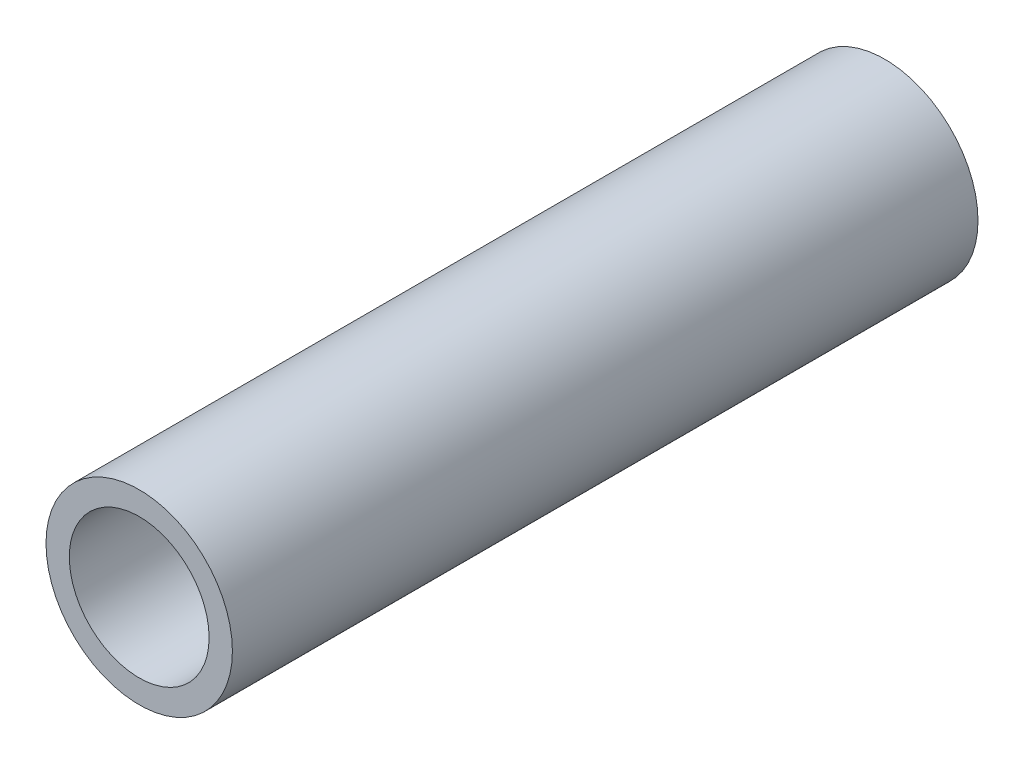
ISO-10303-21;
HEADER;
FILE_DESCRIPTION(('STEP AP214'),'2;1');
FILE_NAME('part.step','',(''),(''),'','','');
FILE_SCHEMA(('AUTOMOTIVE_DESIGN { 1 0 10303 214 1 1 1 1 }'));
ENDSEC;
DATA;
#1=APPLICATION_CONTEXT('core data for automotive mechanical design processes');
#2=APPLICATION_PROTOCOL_DEFINITION('international standard','automotive_design',2000,#1);
#3=PRODUCT_CONTEXT('',#1,'mechanical');
#4=PRODUCT('Part','Part','',(#3));
#5=PRODUCT_RELATED_PRODUCT_CATEGORY('part','',(#4));
#6=PRODUCT_DEFINITION_FORMATION('','',#4);
#7=PRODUCT_DEFINITION_CONTEXT('part definition',#1,'design');
#8=PRODUCT_DEFINITION('design','',#6,#7);
#9=PRODUCT_DEFINITION_SHAPE('','',#8);
#10=(LENGTH_UNIT() NAMED_UNIT(*) SI_UNIT(.MILLI.,.METRE.));
#11=(NAMED_UNIT(*) PLANE_ANGLE_UNIT() SI_UNIT($,.RADIAN.));
#12=(NAMED_UNIT(*) SI_UNIT($,.STERADIAN.) SOLID_ANGLE_UNIT());
#13=UNCERTAINTY_MEASURE_WITH_UNIT(LENGTH_MEASURE(1.E-05),#10,'distance_accuracy_value','');
#14=(GEOMETRIC_REPRESENTATION_CONTEXT(3) GLOBAL_UNCERTAINTY_ASSIGNED_CONTEXT((#13)) GLOBAL_UNIT_ASSIGNED_CONTEXT((#10,
#11,#12)) REPRESENTATION_CONTEXT('',''));
#15=CARTESIAN_POINT('',(0.,0.,0.));
#16=DIRECTION('',(0.,0.,1.));
#17=DIRECTION('',(1.,0.,0.));
#18=AXIS2_PLACEMENT_3D('',#15,#16,#17);
#19=CARTESIAN_POINT('',(0.,0.,160.));
#20=DIRECTION('',(0.,0.,1.));
#21=DIRECTION('',(1.,0.,0.));
#22=AXIS2_PLACEMENT_3D('',#19,#20,#21);
#23=PLANE('',#22);
#24=CARTESIAN_POINT('',(0.,0.,160.));
#25=DIRECTION('',(0.,0.,1.));
#26=DIRECTION('',(1.,0.,0.));
#27=AXIS2_PLACEMENT_3D('',#24,#25,#26);
#28=CIRCLE('',#27,20.);
#29=CARTESIAN_POINT('',(20.,0.,160.));
#30=VERTEX_POINT('',#29);
#31=EDGE_CURVE('E10',#30,#30,#28,.T.);
#32=ORIENTED_EDGE('',*,*,#31,.T.);
#33=EDGE_LOOP('',(#32));
#34=FACE_BOUND('',#33,.T.);
#35=CARTESIAN_POINT('',(0.,0.,160.));
#36=DIRECTION('',(0.,0.,1.));
#37=DIRECTION('',(1.,0.,0.));
#38=AXIS2_PLACEMENT_3D('',#35,#36,#37);
#39=CIRCLE('',#38,15.);
#40=CARTESIAN_POINT('',(15.,0.,160.));
#41=VERTEX_POINT('',#40);
#42=EDGE_CURVE('E43',#41,#41,#39,.T.);
#43=ORIENTED_EDGE('',*,*,#42,.F.);
#44=EDGE_LOOP('',(#43));
#45=FACE_BOUND('',#44,.T.);
#46=ADVANCED_FACE('F32',(#34,#45),#23,.T.);
#47=CARTESIAN_POINT('',(0.,0.,0.));
#48=DIRECTION('',(0.,0.,1.));
#49=DIRECTION('',(1.,0.,0.));
#50=AXIS2_PLACEMENT_3D('',#47,#48,#49);
#51=PLANE('',#50);
#52=CARTESIAN_POINT('',(0.,0.,0.));
#53=DIRECTION('',(0.,0.,1.));
#54=DIRECTION('',(1.,0.,0.));
#55=AXIS2_PLACEMENT_3D('',#52,#53,#54);
#56=CIRCLE('',#55,20.);
#57=CARTESIAN_POINT('',(20.,0.,0.));
#58=VERTEX_POINT('',#57);
#59=EDGE_CURVE('E36',#58,#58,#56,.T.);
#60=ORIENTED_EDGE('',*,*,#59,.F.);
#61=EDGE_LOOP('',(#60));
#62=FACE_BOUND('',#61,.T.);
#63=CARTESIAN_POINT('',(0.,0.,0.));
#64=DIRECTION('',(0.,0.,1.));
#65=DIRECTION('',(1.,0.,0.));
#66=AXIS2_PLACEMENT_3D('',#63,#64,#65);
#67=CIRCLE('',#66,15.);
#68=CARTESIAN_POINT('',(15.,0.,0.));
#69=VERTEX_POINT('',#68);
#70=EDGE_CURVE('E45',#69,#69,#67,.T.);
#71=ORIENTED_EDGE('',*,*,#70,.T.);
#72=EDGE_LOOP('',(#71));
#73=FACE_BOUND('',#72,.T.);
#74=ADVANCED_FACE('F55',(#62,#73),#51,.F.);
#75=CARTESIAN_POINT('',(0.,0.,160.));
#76=DIRECTION('',(0.,0.,-1.));
#77=DIRECTION('',(-1.,0.,0.));
#78=AXIS2_PLACEMENT_3D('',#75,#76,#77);
#79=CYLINDRICAL_SURFACE('',#78,20.);
#80=ORIENTED_EDGE('',*,*,#31,.F.);
#81=EDGE_LOOP('',(#80));
#82=FACE_BOUND('',#81,.T.);
#83=ORIENTED_EDGE('',*,*,#59,.T.);
#84=EDGE_LOOP('',(#83));
#85=FACE_BOUND('',#84,.T.);
#86=ADVANCED_FACE('F34',(#82,#85),#79,.T.);
#87=CARTESIAN_POINT('',(0.,0.,160.));
#88=DIRECTION('',(0.,0.,-1.));
#89=DIRECTION('',(-1.,0.,0.));
#90=AXIS2_PLACEMENT_3D('',#87,#88,#89);
#91=CYLINDRICAL_SURFACE('',#90,15.);
#92=ORIENTED_EDGE('',*,*,#42,.T.);
#93=EDGE_LOOP('',(#92));
#94=FACE_BOUND('',#93,.T.);
#95=ORIENTED_EDGE('',*,*,#70,.F.);
#96=EDGE_LOOP('',(#95));
#97=FACE_BOUND('',#96,.T.);
#98=ADVANCED_FACE('F51',(#94,#97),#91,.F.);
#99=CLOSED_SHELL('',(#46,#74,#86,#98));
#100=MANIFOLD_SOLID_BREP('B2',#99);
#101=ADVANCED_BREP_SHAPE_REPRESENTATION('',(#18,#100),#14);
#102=SHAPE_DEFINITION_REPRESENTATION(#9,#101);
ENDSEC;
END-ISO-10303-21;
